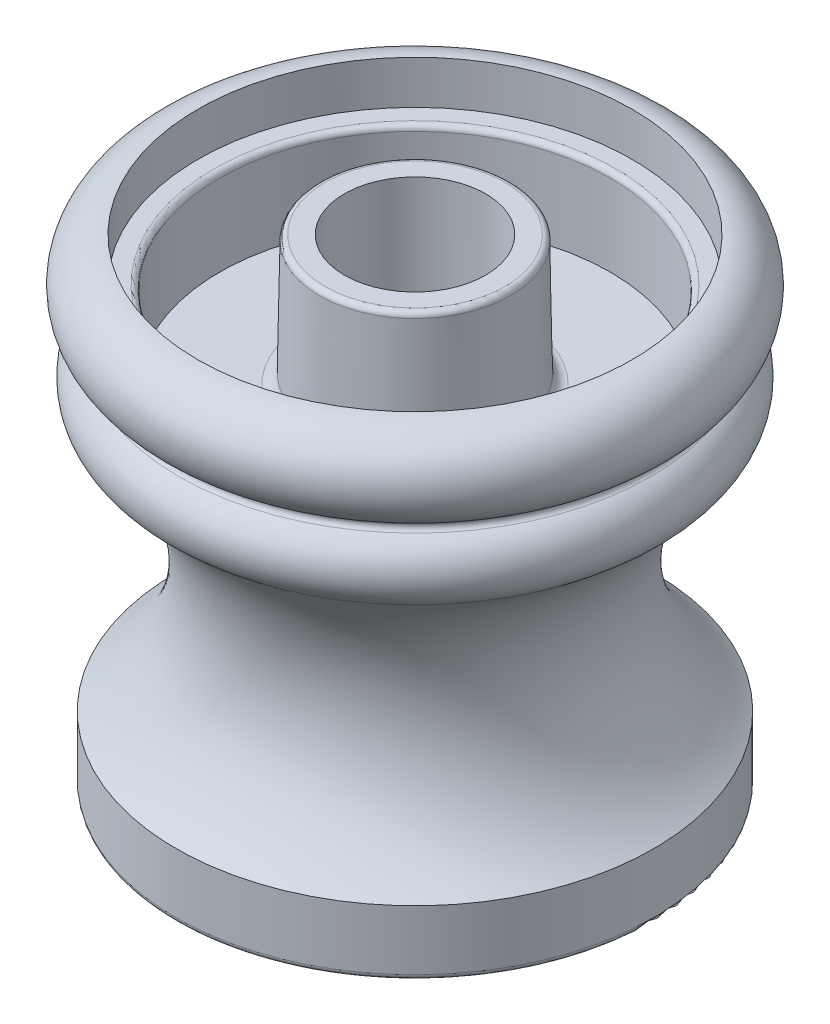
ISO-10303-21;
HEADER;
FILE_DESCRIPTION(('STEP AP214'),'2;1');
FILE_NAME('part.step','',(''),(''),'','','');
FILE_SCHEMA(('AUTOMOTIVE_DESIGN { 1 0 10303 214 1 1 1 1 }'));
ENDSEC;
DATA;
#1=APPLICATION_CONTEXT('core data for automotive mechanical design processes');
#2=APPLICATION_PROTOCOL_DEFINITION('international standard','automotive_design',2000,#1);
#3=PRODUCT_CONTEXT('',#1,'mechanical');
#4=PRODUCT('Part','Part','',(#3));
#5=PRODUCT_RELATED_PRODUCT_CATEGORY('part','',(#4));
#6=PRODUCT_DEFINITION_FORMATION('','',#4);
#7=PRODUCT_DEFINITION_CONTEXT('part definition',#1,'design');
#8=PRODUCT_DEFINITION('design','',#6,#7);
#9=PRODUCT_DEFINITION_SHAPE('','',#8);
#10=(LENGTH_UNIT() NAMED_UNIT(*) SI_UNIT(.MILLI.,.METRE.));
#11=(NAMED_UNIT(*) PLANE_ANGLE_UNIT() SI_UNIT($,.RADIAN.));
#12=(NAMED_UNIT(*) SI_UNIT($,.STERADIAN.) SOLID_ANGLE_UNIT());
#13=UNCERTAINTY_MEASURE_WITH_UNIT(LENGTH_MEASURE(1.E-05),#10,'distance_accuracy_value','');
#14=(GEOMETRIC_REPRESENTATION_CONTEXT(3) GLOBAL_UNCERTAINTY_ASSIGNED_CONTEXT((#13)) GLOBAL_UNIT_ASSIGNED_CONTEXT((#10,
#11,#12)) REPRESENTATION_CONTEXT('',''));
#15=CARTESIAN_POINT('',(0.,0.,0.));
#16=DIRECTION('',(0.,0.,1.));
#17=DIRECTION('',(1.,0.,0.));
#18=AXIS2_PLACEMENT_3D('',#15,#16,#17);
#19=CARTESIAN_POINT('',(0.,0.,0.));
#20=DIRECTION('',(0.,-1.,0.));
#21=DIRECTION('',(0.,0.,-1.));
#22=AXIS2_PLACEMENT_3D('',#19,#20,#21);
#23=PLANE('',#22);
#24=CARTESIAN_POINT('',(0.,0.,0.));
#25=DIRECTION('',(0.,-1.,0.));
#26=DIRECTION('',(0.,0.,-1.));
#27=AXIS2_PLACEMENT_3D('',#24,#25,#26);
#28=CIRCLE('',#27,10.75);
#29=CARTESIAN_POINT('',(0.,0.,-10.75));
#30=VERTEX_POINT('',#29);
#31=EDGE_CURVE('E56',#30,#30,#28,.T.);
#32=ORIENTED_EDGE('',*,*,#31,.T.);
#33=EDGE_LOOP('',(#32));
#34=FACE_BOUND('',#33,.T.);
#35=CARTESIAN_POINT('',(0.,0.,0.));
#36=DIRECTION('',(0.,-1.,0.));
#37=DIRECTION('',(0.,0.,-1.));
#38=AXIS2_PLACEMENT_3D('',#35,#36,#37);
#39=CIRCLE('',#38,6.);
#40=CARTESIAN_POINT('',(0.,0.,-6.));
#41=VERTEX_POINT('',#40);
#42=EDGE_CURVE('E102',#41,#41,#39,.T.);
#43=ORIENTED_EDGE('',*,*,#42,.F.);
#44=EDGE_LOOP('',(#43));
#45=FACE_BOUND('',#44,.T.);
#46=ADVANCED_FACE('F39',(#34,#45),#23,.T.);
#47=CARTESIAN_POINT('',(0.,20.,0.));
#48=DIRECTION('',(0.,-1.,0.));
#49=DIRECTION('',(0.,0.,-1.));
#50=AXIS2_PLACEMENT_3D('',#47,#48,#49);
#51=TOROIDAL_SURFACE('',#50,10.,2.);
#52=CARTESIAN_POINT('',(0.,22.,0.));
#53=DIRECTION('',(0.,1.,0.));
#54=DIRECTION('',(0.,0.,1.));
#55=AXIS2_PLACEMENT_3D('',#52,#53,#54);
#56=CIRCLE('',#55,10.);
#57=CARTESIAN_POINT('',(0.,22.,10.));
#58=VERTEX_POINT('',#57);
#59=EDGE_CURVE('E109',#58,#58,#56,.T.);
#60=ORIENTED_EDGE('',*,*,#59,.F.);
#61=EDGE_LOOP('',(#60));
#62=FACE_BOUND('',#61,.T.);
#63=CARTESIAN_POINT('',(0.,18.2020202020202,0.));
#64=DIRECTION('',(0.,-1.,0.));
#65=DIRECTION('',(0.,0.,-1.));
#66=AXIS2_PLACEMENT_3D('',#63,#64,#65);
#67=CIRCLE('',#66,10.8759387227749);
#68=CARTESIAN_POINT('',(0.,18.2020202020202,-10.8759387227749));
#69=VERTEX_POINT('',#68);
#70=EDGE_CURVE('E83',#69,#69,#67,.T.);
#71=ORIENTED_EDGE('',*,*,#70,.F.);
#72=EDGE_LOOP('',(#71));
#73=FACE_BOUND('',#72,.T.);
#74=ADVANCED_FACE('F149',(#62,#73),#51,.T.);
#75=CARTESIAN_POINT('',(0.,17.9772727272727,0.));
#76=DIRECTION('',(0.,-1.,0.));
#77=DIRECTION('',(0.,0.,-1.));
#78=AXIS2_PLACEMENT_3D('',#75,#76,#77);
#79=TOROIDAL_SURFACE('',#78,10.9854310631218,0.25);
#80=ORIENTED_EDGE('',*,*,#70,.T.);
#81=EDGE_LOOP('',(#80));
#82=FACE_BOUND('',#81,.T.);
#83=CARTESIAN_POINT('',(0.,17.7628458498024,0.));
#84=DIRECTION('',(0.,-1.,0.));
#85=DIRECTION('',(0.,0.,-1.));
#86=AXIS2_PLACEMENT_3D('',#83,#84,#85);
#87=CIRCLE('',#86,10.8568965766276);
#88=CARTESIAN_POINT('',(0.,17.7628458498024,-10.8568965766276));
#89=VERTEX_POINT('',#88);
#90=EDGE_CURVE('E84',#89,#89,#87,.T.);
#91=ORIENTED_EDGE('',*,*,#90,.F.);
#92=EDGE_LOOP('',(#91));
#93=FACE_BOUND('',#92,.T.);
#94=ADVANCED_FACE('F160',(#82,#93),#79,.F.);
#95=CARTESIAN_POINT('',(0.,16.3333333333333,0.));
#96=DIRECTION('',(0.,-1.,0.));
#97=DIRECTION('',(0.,0.,-1.));
#98=AXIS2_PLACEMENT_3D('',#95,#96,#97);
#99=TOROIDAL_SURFACE('',#98,10.,1.66666666666666);
#100=ORIENTED_EDGE('',*,*,#90,.T.);
#101=EDGE_LOOP('',(#100));
#102=FACE_BOUND('',#101,.T.);
#103=CARTESIAN_POINT('',(0.,15.,0.));
#104=DIRECTION('',(0.,-1.,0.));
#105=DIRECTION('',(0.,0.,-1.));
#106=AXIS2_PLACEMENT_3D('',#103,#104,#105);
#107=CIRCLE('',#106,11.);
#108=CARTESIAN_POINT('',(0.,15.,-11.));
#109=VERTEX_POINT('',#108);
#110=EDGE_CURVE('E86',#109,#109,#107,.T.);
#111=ORIENTED_EDGE('',*,*,#110,.F.);
#112=EDGE_LOOP('',(#111));
#113=FACE_BOUND('',#112,.T.);
#114=ADVANCED_FACE('F171',(#102,#113),#99,.T.);
#115=CARTESIAN_POINT('',(0.,9.,0.));
#116=DIRECTION('',(0.,-1.,0.));
#117=DIRECTION('',(0.,0.,-1.));
#118=AXIS2_PLACEMENT_3D('',#115,#116,#117);
#119=TOROIDAL_SURFACE('',#118,15.5,7.5);
#120=ORIENTED_EDGE('',*,*,#110,.T.);
#121=EDGE_LOOP('',(#120));
#122=FACE_BOUND('',#121,.T.);
#123=CARTESIAN_POINT('',(0.,3.,0.));
#124=DIRECTION('',(0.,-1.,0.));
#125=DIRECTION('',(0.,0.,-1.));
#126=AXIS2_PLACEMENT_3D('',#123,#124,#125);
#127=CIRCLE('',#126,11.);
#128=CARTESIAN_POINT('',(0.,3.,-11.));
#129=VERTEX_POINT('',#128);
#130=EDGE_CURVE('E93',#129,#129,#127,.T.);
#131=ORIENTED_EDGE('',*,*,#130,.F.);
#132=EDGE_LOOP('',(#131));
#133=FACE_BOUND('',#132,.T.);
#134=ADVANCED_FACE('F170',(#122,#133),#119,.F.);
#135=CARTESIAN_POINT('',(0.,0.,0.));
#136=DIRECTION('',(0.,-1.,0.));
#137=DIRECTION('',(0.,0.,-1.));
#138=AXIS2_PLACEMENT_3D('',#135,#136,#137);
#139=CYLINDRICAL_SURFACE('',#138,11.);
#140=CARTESIAN_POINT('',(0.,0.25,0.));
#141=DIRECTION('',(0.,-1.,0.));
#142=DIRECTION('',(0.,0.,-1.));
#143=AXIS2_PLACEMENT_3D('',#140,#141,#142);
#144=CIRCLE('',#143,11.);
#145=CARTESIAN_POINT('',(0.,0.25,-11.));
#146=VERTEX_POINT('',#145);
#147=EDGE_CURVE('E52',#146,#146,#144,.F.);
#148=ORIENTED_EDGE('',*,*,#147,.T.);
#149=EDGE_LOOP('',(#148));
#150=FACE_BOUND('',#149,.T.);
#151=ORIENTED_EDGE('',*,*,#130,.T.);
#152=EDGE_LOOP('',(#151));
#153=FACE_BOUND('',#152,.T.);
#154=ADVANCED_FACE('F164',(#150,#153),#139,.T.);
#155=CARTESIAN_POINT('',(0.,12.,0.));
#156=DIRECTION('',(0.,-1.,0.));
#157=DIRECTION('',(0.,0.,-1.));
#158=AXIS2_PLACEMENT_3D('',#155,#156,#157);
#159=PLANE('',#158);
#160=CARTESIAN_POINT('',(0.,12.,0.));
#161=DIRECTION('',(0.,-1.,0.));
#162=DIRECTION('',(0.,0.,-1.));
#163=AXIS2_PLACEMENT_3D('',#160,#161,#162);
#164=CIRCLE('',#163,3.25);
#165=CARTESIAN_POINT('',(0.,12.,-3.25));
#166=VERTEX_POINT('',#165);
#167=EDGE_CURVE('E122',#166,#166,#164,.T.);
#168=ORIENTED_EDGE('',*,*,#167,.F.);
#169=EDGE_LOOP('',(#168));
#170=FACE_BOUND('',#169,.T.);
#171=CARTESIAN_POINT('',(0.,12.,0.));
#172=DIRECTION('',(0.,-1.,0.));
#173=DIRECTION('',(0.,0.,-1.));
#174=AXIS2_PLACEMENT_3D('',#171,#172,#173);
#175=CIRCLE('',#174,4.5);
#176=CARTESIAN_POINT('',(0.,12.,-4.5));
#177=VERTEX_POINT('',#176);
#178=EDGE_CURVE('E97',#177,#177,#175,.T.);
#179=ORIENTED_EDGE('',*,*,#178,.T.);
#180=EDGE_LOOP('',(#179));
#181=FACE_BOUND('',#180,.T.);
#182=ADVANCED_FACE('F161',(#170,#181),#159,.T.);
#183=CARTESIAN_POINT('',(0.,0.,0.));
#184=DIRECTION('',(0.,-1.,0.));
#185=DIRECTION('',(0.,0.,-1.));
#186=AXIS2_PLACEMENT_3D('',#183,#184,#185);
#187=CYLINDRICAL_SURFACE('',#186,4.5);
#188=CARTESIAN_POINT('',(0.,0.545955351399294,0.));
#189=DIRECTION('',(0.,-1.,0.));
#190=DIRECTION('',(0.,0.,-1.));
#191=AXIS2_PLACEMENT_3D('',#188,#189,#190);
#192=CIRCLE('',#191,4.5);
#193=CARTESIAN_POINT('',(0.,0.545955351399294,-4.5));
#194=VERTEX_POINT('',#193);
#195=EDGE_CURVE('E103',#194,#194,#192,.T.);
#196=ORIENTED_EDGE('',*,*,#195,.T.);
#197=EDGE_LOOP('',(#196));
#198=FACE_BOUND('',#197,.T.);
#199=ORIENTED_EDGE('',*,*,#178,.F.);
#200=EDGE_LOOP('',(#199));
#201=FACE_BOUND('',#200,.T.);
#202=ADVANCED_FACE('F254',(#198,#201),#187,.F.);
#203=CARTESIAN_POINT('',(0.,0.545955351399294,0.));
#204=DIRECTION('',(0.,-1.,0.));
#205=DIRECTION('',(0.,0.,-1.));
#206=AXIS2_PLACEMENT_3D('',#203,#204,#205);
#207=CONICAL_SURFACE('',#206,4.5,1.22173047639604);
#208=ORIENTED_EDGE('',*,*,#42,.T.);
#209=EDGE_LOOP('',(#208));
#210=FACE_BOUND('',#209,.T.);
#211=ORIENTED_EDGE('',*,*,#195,.F.);
#212=EDGE_LOOP('',(#211));
#213=FACE_BOUND('',#212,.T.);
#214=ADVANCED_FACE('F245',(#210,#213),#207,.F.);
#215=CARTESIAN_POINT('',(0.,20.,0.));
#216=DIRECTION('',(0.,1.,0.));
#217=DIRECTION('',(0.,0.,1.));
#218=AXIS2_PLACEMENT_3D('',#215,#216,#217);
#219=CYLINDRICAL_SURFACE('',#218,10.);
#220=CARTESIAN_POINT('',(0.,20.,0.));
#221=DIRECTION('',(0.,1.,0.));
#222=DIRECTION('',(0.,0.,1.));
#223=AXIS2_PLACEMENT_3D('',#220,#221,#222);
#224=CIRCLE('',#223,10.);
#225=CARTESIAN_POINT('',(0.,20.,10.));
#226=VERTEX_POINT('',#225);
#227=EDGE_CURVE('E107',#226,#226,#224,.T.);
#228=ORIENTED_EDGE('',*,*,#227,.F.);
#229=EDGE_LOOP('',(#228));
#230=FACE_BOUND('',#229,.T.);
#231=ORIENTED_EDGE('',*,*,#59,.T.);
#232=EDGE_LOOP('',(#231));
#233=FACE_BOUND('',#232,.T.);
#234=ADVANCED_FACE('F235',(#230,#233),#219,.F.);
#235=CARTESIAN_POINT('',(0.,20.,0.));
#236=DIRECTION('',(0.,1.,0.));
#237=DIRECTION('',(0.,0.,1.));
#238=AXIS2_PLACEMENT_3D('',#235,#236,#237);
#239=PLANE('',#238);
#240=CARTESIAN_POINT('',(0.,20.,0.));
#241=DIRECTION('',(0.,1.,0.));
#242=DIRECTION('',(0.,0.,1.));
#243=AXIS2_PLACEMENT_3D('',#240,#241,#242);
#244=CIRCLE('',#243,9.25);
#245=CARTESIAN_POINT('',(0.,20.,9.25));
#246=VERTEX_POINT('',#245);
#247=EDGE_CURVE('E73',#246,#246,#244,.F.);
#248=ORIENTED_EDGE('',*,*,#247,.T.);
#249=EDGE_LOOP('',(#248));
#250=FACE_BOUND('',#249,.T.);
#251=ORIENTED_EDGE('',*,*,#227,.T.);
#252=EDGE_LOOP('',(#251));
#253=FACE_BOUND('',#252,.T.);
#254=ADVANCED_FACE('F225',(#250,#253),#239,.T.);
#255=CARTESIAN_POINT('',(0.,16.,0.));
#256=DIRECTION('',(0.,1.,0.));
#257=DIRECTION('',(0.,0.,1.));
#258=AXIS2_PLACEMENT_3D('',#255,#256,#257);
#259=CYLINDRICAL_SURFACE('',#258,9.);
#260=CARTESIAN_POINT('',(0.,19.75,0.));
#261=DIRECTION('',(0.,1.,0.));
#262=DIRECTION('',(0.,0.,1.));
#263=AXIS2_PLACEMENT_3D('',#260,#261,#262);
#264=CIRCLE('',#263,9.);
#265=CARTESIAN_POINT('',(0.,19.75,9.));
#266=VERTEX_POINT('',#265);
#267=EDGE_CURVE('E80',#266,#266,#264,.T.);
#268=ORIENTED_EDGE('',*,*,#267,.T.);
#269=EDGE_LOOP('',(#268));
#270=FACE_BOUND('',#269,.T.);
#271=CARTESIAN_POINT('',(0.,16.,0.));
#272=DIRECTION('',(0.,1.,0.));
#273=DIRECTION('',(0.,0.,1.));
#274=AXIS2_PLACEMENT_3D('',#271,#272,#273);
#275=CIRCLE('',#274,9.);
#276=CARTESIAN_POINT('',(0.,16.,9.));
#277=VERTEX_POINT('',#276);
#278=EDGE_CURVE('E112',#277,#277,#275,.T.);
#279=ORIENTED_EDGE('',*,*,#278,.F.);
#280=EDGE_LOOP('',(#279));
#281=FACE_BOUND('',#280,.T.);
#282=ADVANCED_FACE('F213',(#270,#281),#259,.F.);
#283=CARTESIAN_POINT('',(0.,16.,0.));
#284=DIRECTION('',(0.,1.,0.));
#285=DIRECTION('',(0.,0.,1.));
#286=AXIS2_PLACEMENT_3D('',#283,#284,#285);
#287=PLANE('',#286);
#288=CARTESIAN_POINT('',(0.,16.,0.));
#289=DIRECTION('',(0.,1.,0.));
#290=DIRECTION('',(0.,0.,1.));
#291=AXIS2_PLACEMENT_3D('',#288,#289,#290);
#292=CIRCLE('',#291,4.99134863155784);
#293=CARTESIAN_POINT('',(0.,16.,4.99134863155784));
#294=VERTEX_POINT('',#293);
#295=EDGE_CURVE('E10',#294,#294,#292,.F.);
#296=ORIENTED_EDGE('',*,*,#295,.T.);
#297=EDGE_LOOP('',(#296));
#298=FACE_BOUND('',#297,.T.);
#299=ORIENTED_EDGE('',*,*,#278,.T.);
#300=EDGE_LOOP('',(#299));
#301=FACE_BOUND('',#300,.T.);
#302=ADVANCED_FACE('F150',(#298,#301),#287,.T.);
#303=CARTESIAN_POINT('',(0.,16.,0.));
#304=DIRECTION('',(0.,-1.,0.));
#305=DIRECTION('',(0.,0.,1.));
#306=AXIS2_PLACEMENT_3D('',#303,#304,#305);
#307=CONICAL_SURFACE('',#306,4.5,0.0174532925199433);
#308=CARTESIAN_POINT('',(0.,16.4912737967813,0.));
#309=DIRECTION('',(0.,1.,0.));
#310=DIRECTION('',(0.,0.,1.));
#311=AXIS2_PLACEMENT_3D('',#308,#309,#310);
#312=CIRCLE('',#311,4.49142478397965);
#313=CARTESIAN_POINT('',(0.,16.4912737967813,4.49142478397965));
#314=VERTEX_POINT('',#313);
#315=EDGE_CURVE('E50',#314,#314,#312,.T.);
#316=ORIENTED_EDGE('',*,*,#315,.T.);
#317=EDGE_LOOP('',(#316));
#318=FACE_BOUND('',#317,.T.);
#319=CARTESIAN_POINT('',(0.,21.7543631016093,0.));
#320=DIRECTION('',(0.,-1.,0.));
#321=DIRECTION('',(0.,0.,-1.));
#322=AXIS2_PLACEMENT_3D('',#319,#320,#321);
#323=CIRCLE('',#322,4.39955721844087);
#324=CARTESIAN_POINT('',(0.,21.7543631016093,-4.39955721844087));
#325=VERTEX_POINT('',#324);
#326=EDGE_CURVE('E64',#325,#325,#323,.T.);
#327=ORIENTED_EDGE('',*,*,#326,.T.);
#328=EDGE_LOOP('',(#327));
#329=FACE_BOUND('',#328,.T.);
#330=ADVANCED_FACE('F133',(#318,#329),#307,.T.);
#331=CARTESIAN_POINT('',(0.,22.,0.));
#332=DIRECTION('',(0.,1.,0.));
#333=DIRECTION('',(0.,0.,1.));
#334=AXIS2_PLACEMENT_3D('',#331,#332,#333);
#335=PLANE('',#334);
#336=CARTESIAN_POINT('',(0.,22.,0.));
#337=DIRECTION('',(0.,1.,0.));
#338=DIRECTION('',(0.,0.,1.));
#339=AXIS2_PLACEMENT_3D('',#336,#337,#338);
#340=CIRCLE('',#339,4.14959529465177);
#341=CARTESIAN_POINT('',(0.,22.,4.14959529465177));
#342=VERTEX_POINT('',#341);
#343=EDGE_CURVE('E66',#342,#342,#340,.T.);
#344=ORIENTED_EDGE('',*,*,#343,.T.);
#345=EDGE_LOOP('',(#344));
#346=FACE_BOUND('',#345,.T.);
#347=CARTESIAN_POINT('',(0.,22.,0.));
#348=DIRECTION('',(0.,1.,0.));
#349=DIRECTION('',(0.,0.,1.));
#350=AXIS2_PLACEMENT_3D('',#347,#348,#349);
#351=CIRCLE('',#350,3.25);
#352=CARTESIAN_POINT('',(0.,22.,3.25));
#353=VERTEX_POINT('',#352);
#354=EDGE_CURVE('E123',#353,#353,#351,.T.);
#355=ORIENTED_EDGE('',*,*,#354,.F.);
#356=EDGE_LOOP('',(#355));
#357=FACE_BOUND('',#356,.T.);
#358=ADVANCED_FACE('F135',(#346,#357),#335,.T.);
#359=CARTESIAN_POINT('',(0.,0.,0.));
#360=DIRECTION('',(0.,1.,0.));
#361=DIRECTION('',(0.,0.,1.));
#362=AXIS2_PLACEMENT_3D('',#359,#360,#361);
#363=CYLINDRICAL_SURFACE('',#362,3.25);
#364=ORIENTED_EDGE('',*,*,#167,.T.);
#365=EDGE_LOOP('',(#364));
#366=FACE_BOUND('',#365,.T.);
#367=ORIENTED_EDGE('',*,*,#354,.T.);
#368=EDGE_LOOP('',(#367));
#369=FACE_BOUND('',#368,.T.);
#370=ADVANCED_FACE('F132',(#366,#369),#363,.F.);
#371=CARTESIAN_POINT('',(0.,19.75,0.));
#372=DIRECTION('',(0.,1.,0.));
#373=DIRECTION('',(0.,0.,1.));
#374=AXIS2_PLACEMENT_3D('',#371,#372,#373);
#375=TOROIDAL_SURFACE('',#374,9.25,0.25);
#376=ORIENTED_EDGE('',*,*,#247,.F.);
#377=EDGE_LOOP('',(#376));
#378=FACE_BOUND('',#377,.T.);
#379=ORIENTED_EDGE('',*,*,#267,.F.);
#380=EDGE_LOOP('',(#379));
#381=FACE_BOUND('',#380,.T.);
#382=ADVANCED_FACE('F141',(#378,#381),#375,.T.);
#383=CARTESIAN_POINT('',(0.,21.75,0.));
#384=DIRECTION('',(0.,1.,0.));
#385=DIRECTION('',(0.,0.,1.));
#386=AXIS2_PLACEMENT_3D('',#383,#384,#385);
#387=TOROIDAL_SURFACE('',#386,4.14959529465177,0.25);
#388=ORIENTED_EDGE('',*,*,#326,.F.);
#389=EDGE_LOOP('',(#388));
#390=FACE_BOUND('',#389,.T.);
#391=ORIENTED_EDGE('',*,*,#343,.F.);
#392=EDGE_LOOP('',(#391));
#393=FACE_BOUND('',#392,.T.);
#394=ADVANCED_FACE('F179',(#390,#393),#387,.T.);
#395=CARTESIAN_POINT('',(0.,0.25,0.));
#396=DIRECTION('',(0.,-1.,0.));
#397=DIRECTION('',(0.,0.,-1.));
#398=AXIS2_PLACEMENT_3D('',#395,#396,#397);
#399=TOROIDAL_SURFACE('',#398,10.75,0.25);
#400=ORIENTED_EDGE('',*,*,#147,.F.);
#401=EDGE_LOOP('',(#400));
#402=FACE_BOUND('',#401,.T.);
#403=ORIENTED_EDGE('',*,*,#31,.F.);
#404=EDGE_LOOP('',(#403));
#405=FACE_BOUND('',#404,.T.);
#406=ADVANCED_FACE('F182',(#402,#405),#399,.T.);
#407=CARTESIAN_POINT('',(0.,16.5,0.));
#408=DIRECTION('',(0.,1.,0.));
#409=DIRECTION('',(0.,0.,1.));
#410=AXIS2_PLACEMENT_3D('',#407,#408,#409);
#411=TOROIDAL_SURFACE('',#410,4.99134863155784,0.5);
#412=ORIENTED_EDGE('',*,*,#295,.F.);
#413=EDGE_LOOP('',(#412));
#414=FACE_BOUND('',#413,.T.);
#415=ORIENTED_EDGE('',*,*,#315,.F.);
#416=EDGE_LOOP('',(#415));
#417=FACE_BOUND('',#416,.T.);
#418=ADVANCED_FACE('F41',(#414,#417),#411,.F.);
#419=CLOSED_SHELL('',(#46,#74,#94,#114,#134,#154,#182,#202,#214,#234,#254,#282,#302,#330,#358,
#370,#382,#394,#406,#418));
#420=MANIFOLD_SOLID_BREP('B2',#419);
#421=ADVANCED_BREP_SHAPE_REPRESENTATION('',(#18,#420),#14);
#422=SHAPE_DEFINITION_REPRESENTATION(#9,#421);
ENDSEC;
END-ISO-10303-21;
